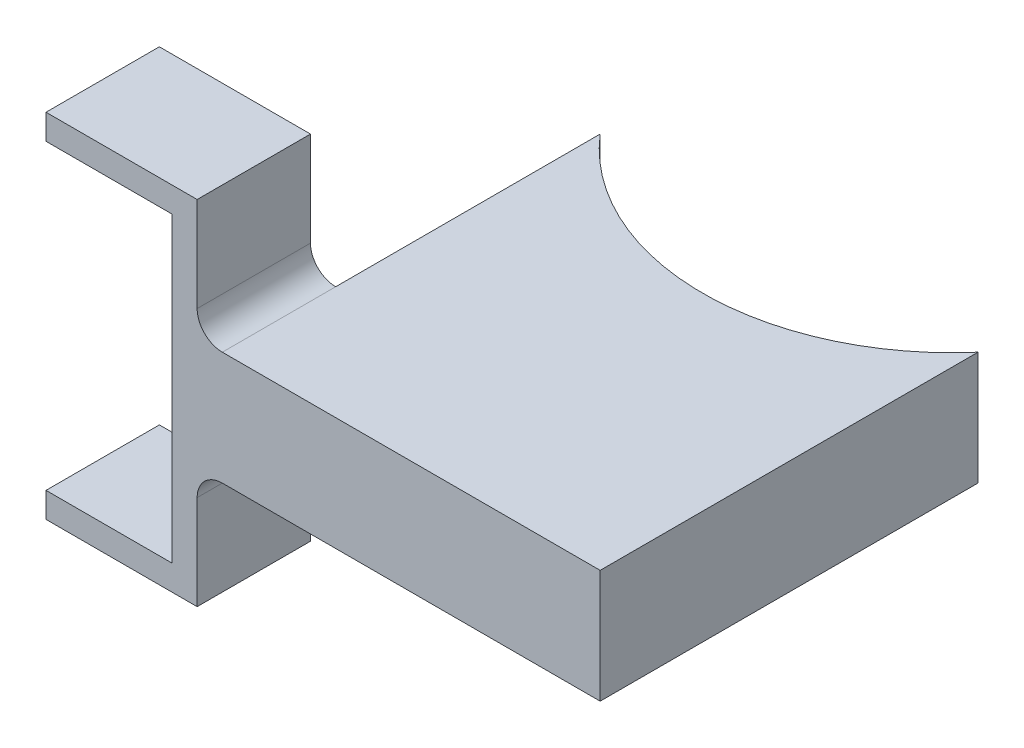
ISO-10303-21;
HEADER;
FILE_DESCRIPTION(('STEP AP214'),'2;1');
FILE_NAME('part.step','',(''),(''),'','','');
FILE_SCHEMA(('AUTOMOTIVE_DESIGN { 1 0 10303 214 1 1 1 1 }'));
ENDSEC;
DATA;
#1=APPLICATION_CONTEXT('core data for automotive mechanical design processes');
#2=APPLICATION_PROTOCOL_DEFINITION('international standard','automotive_design',2000,#1);
#3=PRODUCT_CONTEXT('',#1,'mechanical');
#4=PRODUCT('Part','Part','',(#3));
#5=PRODUCT_RELATED_PRODUCT_CATEGORY('part','',(#4));
#6=PRODUCT_DEFINITION_FORMATION('','',#4);
#7=PRODUCT_DEFINITION_CONTEXT('part definition',#1,'design');
#8=PRODUCT_DEFINITION('design','',#6,#7);
#9=PRODUCT_DEFINITION_SHAPE('','',#8);
#10=(LENGTH_UNIT() NAMED_UNIT(*) SI_UNIT(.MILLI.,.METRE.));
#11=(NAMED_UNIT(*) PLANE_ANGLE_UNIT() SI_UNIT($,.RADIAN.));
#12=(NAMED_UNIT(*) SI_UNIT($,.STERADIAN.) SOLID_ANGLE_UNIT());
#13=UNCERTAINTY_MEASURE_WITH_UNIT(LENGTH_MEASURE(1.E-05),#10,'distance_accuracy_value','');
#14=(GEOMETRIC_REPRESENTATION_CONTEXT(3) GLOBAL_UNCERTAINTY_ASSIGNED_CONTEXT((#13)) GLOBAL_UNIT_ASSIGNED_CONTEXT((#10,
#11,#12)) REPRESENTATION_CONTEXT('',''));
#15=CARTESIAN_POINT('',(0.,0.,0.));
#16=DIRECTION('',(0.,0.,1.));
#17=DIRECTION('',(1.,0.,0.));
#18=AXIS2_PLACEMENT_3D('',#15,#16,#17);
#19=CARTESIAN_POINT('',(-18.145943967969,-9.5,-8.54005946252346));
#20=DIRECTION('',(-1.,0.,0.));
#21=DIRECTION('',(0.,0.,1.));
#22=AXIS2_PLACEMENT_3D('',#19,#20,#21);
#23=PLANE('',#22);
#24=DIRECTION('',(0.,1.,0.));
#25=VECTOR('',#24,1.);
#26=CARTESIAN_POINT('',(-18.145943967969,-9.5,-8.54005946252346));
#27=LINE('',#26,#25);
#28=CARTESIAN_POINT('',(-18.145943967969,-7.5,-8.54005946252346));
#29=VERTEX_POINT('',#28);
#30=CARTESIAN_POINT('',(-18.145943967969,16.5,-8.54005946252346));
#31=VERTEX_POINT('',#30);
#32=EDGE_CURVE('E247',#29,#31,#27,.T.);
#33=ORIENTED_EDGE('',*,*,#32,.F.);
#34=DIRECTION('',(0.,0.,-1.));
#35=VECTOR('',#34,1.);
#36=CARTESIAN_POINT('',(-18.145943967969,-7.5,-8.54005946252346));
#37=LINE('',#36,#35);
#38=CARTESIAN_POINT('',(-18.145943967969,-7.5,0.459940537476534));
#39=VERTEX_POINT('',#38);
#40=EDGE_CURVE('E178',#39,#29,#37,.T.);
#41=ORIENTED_EDGE('',*,*,#40,.F.);
#42=DIRECTION('',(0.,1.,0.));
#43=VECTOR('',#42,1.);
#44=CARTESIAN_POINT('',(-18.145943967969,-9.5,0.459940537476534));
#45=LINE('',#44,#43);
#46=CARTESIAN_POINT('',(-18.145943967969,16.5,0.459940537476534));
#47=VERTEX_POINT('',#46);
#48=EDGE_CURVE('E244',#39,#47,#45,.T.);
#49=ORIENTED_EDGE('',*,*,#48,.T.);
#50=DIRECTION('',(0.,0.,1.));
#51=VECTOR('',#50,1.);
#52=CARTESIAN_POINT('',(-18.145943967969,16.5,-8.54005946252346));
#53=LINE('',#52,#51);
#54=EDGE_CURVE('E195',#31,#47,#53,.T.);
#55=ORIENTED_EDGE('',*,*,#54,.F.);
#56=EDGE_LOOP('',(#33,#41,#49,#55));
#57=FACE_BOUND('',#56,.T.);
#58=ADVANCED_FACE('F41',(#57),#23,.T.);
#59=CARTESIAN_POINT('',(-14.145943967969,9.,0.));
#60=DIRECTION('',(1.,0.,0.));
#61=DIRECTION('',(0.,0.,-1.));
#62=AXIS2_PLACEMENT_3D('',#59,#60,#61);
#63=PLANE('',#62);
#64=DIRECTION('',(0.,-1.,0.));
#65=VECTOR('',#64,1.);
#66=CARTESIAN_POINT('',(-14.145943967969,0.,-8.54005946252346));
#67=LINE('',#66,#65);
#68=CARTESIAN_POINT('',(-14.145943967969,9.,-8.54005946252346));
#69=VERTEX_POINT('',#68);
#70=CARTESIAN_POINT('',(-14.145943967969,0.,-8.54005946252346));
#71=VERTEX_POINT('',#70);
#72=EDGE_CURVE('E242',#69,#71,#67,.T.);
#73=ORIENTED_EDGE('',*,*,#72,.F.);
#74=DIRECTION('',(0.,0.,1.));
#75=VECTOR('',#74,1.);
#76=CARTESIAN_POINT('',(-14.145943967969,9.,0.));
#77=LINE('',#76,#75);
#78=CARTESIAN_POINT('',(-14.145943967969,9.,-29.5400594625235));
#79=VERTEX_POINT('',#78);
#80=EDGE_CURVE('E259',#79,#69,#77,.T.);
#81=ORIENTED_EDGE('',*,*,#80,.F.);
#82=DIRECTION('',(0.,-1.,0.));
#83=VECTOR('',#82,1.);
#84=CARTESIAN_POINT('',(-14.145943967969,9.,-29.5400594625235));
#85=LINE('',#84,#83);
#86=CARTESIAN_POINT('',(-14.145943967969,0.,-29.5400594625235));
#87=VERTEX_POINT('',#86);
#88=EDGE_CURVE('E290',#79,#87,#85,.T.);
#89=ORIENTED_EDGE('',*,*,#88,.T.);
#90=DIRECTION('',(0.,0.,1.));
#91=VECTOR('',#90,1.);
#92=CARTESIAN_POINT('',(-14.145943967969,0.,0.));
#93=LINE('',#92,#91);
#94=EDGE_CURVE('E274',#87,#71,#93,.T.);
#95=ORIENTED_EDGE('',*,*,#94,.T.);
#96=EDGE_LOOP('',(#73,#81,#89,#95));
#97=FACE_BOUND('',#96,.T.);
#98=ADVANCED_FACE('F317',(#97),#63,.F.);
#99=CARTESIAN_POINT('',(0.854056032030967,9.,-42.4644549996463));
#100=DIRECTION('',(0.,-1.,0.));
#101=DIRECTION('',(0.,0.,-1.));
#102=AXIS2_PLACEMENT_3D('',#99,#100,#101);
#103=CYLINDRICAL_SURFACE('',#102,19.8);
#104=CARTESIAN_POINT('',(0.854056032030967,0.,-42.4644549996463));
#105=DIRECTION('',(0.,1.,0.));
#106=DIRECTION('',(0.,0.,1.));
#107=AXIS2_PLACEMENT_3D('',#104,#105,#106);
#108=CIRCLE('',#107,19.8);
#109=CARTESIAN_POINT('',(15.854056032031,0.,-29.5400594625235));
#110=VERTEX_POINT('',#109);
#111=EDGE_CURVE('E254',#87,#110,#108,.T.);
#112=ORIENTED_EDGE('',*,*,#111,.F.);
#113=ORIENTED_EDGE('',*,*,#88,.F.);
#114=CARTESIAN_POINT('',(0.854056032030967,9.,-42.4644549996463));
#115=DIRECTION('',(0.,1.,0.));
#116=DIRECTION('',(0.,0.,1.));
#117=AXIS2_PLACEMENT_3D('',#114,#115,#116);
#118=CIRCLE('',#117,19.8);
#119=CARTESIAN_POINT('',(15.854056032031,9.,-29.5400594625235));
#120=VERTEX_POINT('',#119);
#121=EDGE_CURVE('E255',#79,#120,#118,.T.);
#122=ORIENTED_EDGE('',*,*,#121,.T.);
#123=DIRECTION('',(0.,-1.,0.));
#124=VECTOR('',#123,1.);
#125=CARTESIAN_POINT('',(15.854056032031,9.,-29.5400594625235));
#126=LINE('',#125,#124);
#127=EDGE_CURVE('E270',#120,#110,#126,.T.);
#128=ORIENTED_EDGE('',*,*,#127,.T.);
#129=EDGE_LOOP('',(#112,#113,#122,#128));
#130=FACE_BOUND('',#129,.T.);
#131=ADVANCED_FACE('F354',(#130),#103,.F.);
#132=CARTESIAN_POINT('',(0.,9.,0.459940537476534));
#133=DIRECTION('',(0.,0.,-1.));
#134=DIRECTION('',(-1.,0.,0.));
#135=AXIS2_PLACEMENT_3D('',#132,#133,#134);
#136=PLANE('',#135);
#137=DIRECTION('',(0.,1.,0.));
#138=VECTOR('',#137,1.);
#139=CARTESIAN_POINT('',(-16.145943967969,-9.5,0.459940537476534));
#140=LINE('',#139,#138);
#141=CARTESIAN_POINT('',(-16.145943967969,-9.5,0.459940537476534));
#142=VERTEX_POINT('',#141);
#143=CARTESIAN_POINT('',(-16.145943967969,-2.,0.459940537476534));
#144=VERTEX_POINT('',#143);
#145=EDGE_CURVE('E238',#142,#144,#140,.T.);
#146=ORIENTED_EDGE('',*,*,#145,.T.);
#147=CARTESIAN_POINT('',(-14.145943967969,-2.,0.459940537476534));
#148=DIRECTION('',(0.,0.,-1.));
#149=DIRECTION('',(-1.,0.,0.));
#150=AXIS2_PLACEMENT_3D('',#147,#148,#149);
#151=CIRCLE('',#150,2.);
#152=CARTESIAN_POINT('',(-14.145943967969,0.,0.459940537476534));
#153=VERTEX_POINT('',#152);
#154=EDGE_CURVE('E305',#144,#153,#151,.T.);
#155=ORIENTED_EDGE('',*,*,#154,.T.);
#156=DIRECTION('',(1.,0.,0.));
#157=VECTOR('',#156,1.);
#158=CARTESIAN_POINT('',(0.,0.,0.459940537476534));
#159=LINE('',#158,#157);
#160=CARTESIAN_POINT('',(15.854056032031,0.,0.459940537476534));
#161=VERTEX_POINT('',#160);
#162=EDGE_CURVE('E278',#153,#161,#159,.T.);
#163=ORIENTED_EDGE('',*,*,#162,.T.);
#164=DIRECTION('',(0.,-1.,0.));
#165=VECTOR('',#164,1.);
#166=CARTESIAN_POINT('',(15.854056032031,9.,0.459940537476534));
#167=LINE('',#166,#165);
#168=CARTESIAN_POINT('',(15.854056032031,9.,0.459940537476534));
#169=VERTEX_POINT('',#168);
#170=EDGE_CURVE('E286',#169,#161,#167,.T.);
#171=ORIENTED_EDGE('',*,*,#170,.F.);
#172=DIRECTION('',(1.,0.,0.));
#173=VECTOR('',#172,1.);
#174=CARTESIAN_POINT('',(0.,9.,0.459940537476534));
#175=LINE('',#174,#173);
#176=CARTESIAN_POINT('',(-14.145943967969,9.,0.459940537476534));
#177=VERTEX_POINT('',#176);
#178=EDGE_CURVE('E263',#177,#169,#175,.T.);
#179=ORIENTED_EDGE('',*,*,#178,.F.);
#180=CARTESIAN_POINT('',(-14.145943967969,11.,0.459940537476534));
#181=DIRECTION('',(0.,0.,-1.));
#182=DIRECTION('',(-1.,0.,0.));
#183=AXIS2_PLACEMENT_3D('',#180,#181,#182);
#184=CIRCLE('',#183,2.);
#185=CARTESIAN_POINT('',(-16.145943967969,11.,0.459940537476534));
#186=VERTEX_POINT('',#185);
#187=EDGE_CURVE('E11',#177,#186,#184,.T.);
#188=ORIENTED_EDGE('',*,*,#187,.T.);
#189=CARTESIAN_POINT('',(-16.145943967969,18.5,0.459940537476534));
#190=VERTEX_POINT('',#189);
#191=EDGE_CURVE('E243',#186,#190,#140,.T.);
#192=ORIENTED_EDGE('',*,*,#191,.T.);
#193=DIRECTION('',(1.,0.,0.));
#194=VECTOR('',#193,1.);
#195=CARTESIAN_POINT('',(-16.145943967969,18.5,0.459940537476534));
#196=LINE('',#195,#194);
#197=CARTESIAN_POINT('',(-28.145943967969,18.5,0.459940537476534));
#198=VERTEX_POINT('',#197);
#199=EDGE_CURVE('E229',#198,#190,#196,.T.);
#200=ORIENTED_EDGE('',*,*,#199,.F.);
#201=DIRECTION('',(0.,1.,0.));
#202=VECTOR('',#201,1.);
#203=CARTESIAN_POINT('',(-28.145943967969,18.5,0.459940537476534));
#204=LINE('',#203,#202);
#205=CARTESIAN_POINT('',(-28.145943967969,16.5,0.459940537476534));
#206=VERTEX_POINT('',#205);
#207=EDGE_CURVE('E203',#206,#198,#204,.T.);
#208=ORIENTED_EDGE('',*,*,#207,.F.);
#209=DIRECTION('',(1.,0.,0.));
#210=VECTOR('',#209,1.);
#211=CARTESIAN_POINT('',(-28.145943967969,16.5,0.459940537476534));
#212=LINE('',#211,#210);
#213=EDGE_CURVE('E211',#206,#47,#212,.T.);
#214=ORIENTED_EDGE('',*,*,#213,.T.);
#215=ORIENTED_EDGE('',*,*,#48,.F.);
#216=DIRECTION('',(1.,0.,0.));
#217=VECTOR('',#216,1.);
#218=CARTESIAN_POINT('',(-28.145943967969,-7.5,0.459940537476534));
#219=LINE('',#218,#217);
#220=CARTESIAN_POINT('',(-28.145943967969,-7.5,0.459940537476534));
#221=VERTEX_POINT('',#220);
#222=EDGE_CURVE('E191',#221,#39,#219,.T.);
#223=ORIENTED_EDGE('',*,*,#222,.F.);
#224=DIRECTION('',(0.,1.,0.));
#225=VECTOR('',#224,1.);
#226=CARTESIAN_POINT('',(-28.145943967969,-9.5,0.459940537476534));
#227=LINE('',#226,#225);
#228=CARTESIAN_POINT('',(-28.145943967969,-9.5,0.459940537476534));
#229=VERTEX_POINT('',#228);
#230=EDGE_CURVE('E171',#229,#221,#227,.T.);
#231=ORIENTED_EDGE('',*,*,#230,.F.);
#232=DIRECTION('',(1.,0.,0.));
#233=VECTOR('',#232,1.);
#234=CARTESIAN_POINT('',(-16.145943967969,-9.5,0.459940537476534));
#235=LINE('',#234,#233);
#236=EDGE_CURVE('E161',#229,#142,#235,.T.);
#237=ORIENTED_EDGE('',*,*,#236,.T.);
#238=EDGE_LOOP('',(#146,#155,#163,#171,#179,#188,#192,#200,#208,#214,#215,#223,#231,#237));
#239=FACE_BOUND('',#238,.T.);
#240=ADVANCED_FACE('F325',(#239),#136,.F.);
#241=CARTESIAN_POINT('',(15.854056032031,9.,0.));
#242=DIRECTION('',(1.,0.,0.));
#243=DIRECTION('',(0.,0.,-1.));
#244=AXIS2_PLACEMENT_3D('',#241,#242,#243);
#245=PLANE('',#244);
#246=DIRECTION('',(0.,0.,1.));
#247=VECTOR('',#246,1.);
#248=CARTESIAN_POINT('',(15.854056032031,0.,0.));
#249=LINE('',#248,#247);
#250=EDGE_CURVE('E260',#110,#161,#249,.T.);
#251=ORIENTED_EDGE('',*,*,#250,.F.);
#252=ORIENTED_EDGE('',*,*,#127,.F.);
#253=DIRECTION('',(0.,0.,1.));
#254=VECTOR('',#253,1.);
#255=CARTESIAN_POINT('',(15.854056032031,9.,0.));
#256=LINE('',#255,#254);
#257=EDGE_CURVE('E266',#120,#169,#256,.T.);
#258=ORIENTED_EDGE('',*,*,#257,.T.);
#259=ORIENTED_EDGE('',*,*,#170,.T.);
#260=EDGE_LOOP('',(#251,#252,#258,#259));
#261=FACE_BOUND('',#260,.T.);
#262=ADVANCED_FACE('F368',(#261),#245,.T.);
#263=CARTESIAN_POINT('',(0.,9.,0.));
#264=DIRECTION('',(0.,1.,0.));
#265=DIRECTION('',(0.,0.,1.));
#266=AXIS2_PLACEMENT_3D('',#263,#264,#265);
#267=PLANE('',#266);
#268=ORIENTED_EDGE('',*,*,#80,.T.);
#269=DIRECTION('',(0.,0.,-1.));
#270=VECTOR('',#269,1.);
#271=CARTESIAN_POINT('',(-14.145943967969,9.,0.459940537476534));
#272=LINE('',#271,#270);
#273=EDGE_CURVE('E57',#69,#177,#272,.F.);
#274=ORIENTED_EDGE('',*,*,#273,.T.);
#275=ORIENTED_EDGE('',*,*,#178,.T.);
#276=ORIENTED_EDGE('',*,*,#257,.F.);
#277=ORIENTED_EDGE('',*,*,#121,.F.);
#278=EDGE_LOOP('',(#268,#274,#275,#276,#277));
#279=FACE_BOUND('',#278,.T.);
#280=ADVANCED_FACE('F320',(#279),#267,.T.);
#281=CARTESIAN_POINT('',(0.,0.,0.));
#282=DIRECTION('',(0.,1.,0.));
#283=DIRECTION('',(0.,0.,1.));
#284=AXIS2_PLACEMENT_3D('',#281,#282,#283);
#285=PLANE('',#284);
#286=ORIENTED_EDGE('',*,*,#162,.F.);
#287=DIRECTION('',(0.,0.,1.));
#288=VECTOR('',#287,1.);
#289=CARTESIAN_POINT('',(-14.145943967969,0.,0.));
#290=LINE('',#289,#288);
#291=EDGE_CURVE('E297',#153,#71,#290,.F.);
#292=ORIENTED_EDGE('',*,*,#291,.T.);
#293=ORIENTED_EDGE('',*,*,#94,.F.);
#294=ORIENTED_EDGE('',*,*,#111,.T.);
#295=ORIENTED_EDGE('',*,*,#250,.T.);
#296=EDGE_LOOP('',(#286,#292,#293,#294,#295));
#297=FACE_BOUND('',#296,.T.);
#298=ADVANCED_FACE('F365',(#297),#285,.F.);
#299=CARTESIAN_POINT('',(-16.145943967969,0.,-8.54005946252346));
#300=DIRECTION('',(0.,0.,1.));
#301=DIRECTION('',(1.,0.,0.));
#302=AXIS2_PLACEMENT_3D('',#299,#300,#301);
#303=PLANE('',#302);
#304=ORIENTED_EDGE('',*,*,#72,.T.);
#305=CARTESIAN_POINT('',(-14.145943967969,-2.,-8.54005946252346));
#306=DIRECTION('',(0.,0.,1.));
#307=DIRECTION('',(1.,0.,0.));
#308=AXIS2_PLACEMENT_3D('',#305,#306,#307);
#309=CIRCLE('',#308,2.);
#310=CARTESIAN_POINT('',(-16.145943967969,-2.,-8.54005946252346));
#311=VERTEX_POINT('',#310);
#312=EDGE_CURVE('E308',#71,#311,#309,.T.);
#313=ORIENTED_EDGE('',*,*,#312,.T.);
#314=DIRECTION('',(0.,1.,0.));
#315=VECTOR('',#314,1.);
#316=CARTESIAN_POINT('',(-16.145943967969,-9.5,-8.54005946252346));
#317=LINE('',#316,#315);
#318=CARTESIAN_POINT('',(-16.145943967969,-9.5,-8.54005946252346));
#319=VERTEX_POINT('',#318);
#320=EDGE_CURVE('E156',#319,#311,#317,.T.);
#321=ORIENTED_EDGE('',*,*,#320,.F.);
#322=DIRECTION('',(-1.,0.,0.));
#323=VECTOR('',#322,1.);
#324=CARTESIAN_POINT('',(-16.145943967969,-9.5,-8.54005946252346));
#325=LINE('',#324,#323);
#326=CARTESIAN_POINT('',(-28.145943967969,-9.5,-8.54005946252346));
#327=VERTEX_POINT('',#326);
#328=EDGE_CURVE('E148',#319,#327,#325,.T.);
#329=ORIENTED_EDGE('',*,*,#328,.T.);
#330=DIRECTION('',(0.,-1.,0.));
#331=VECTOR('',#330,1.);
#332=CARTESIAN_POINT('',(-28.145943967969,-9.5,-8.54005946252346));
#333=LINE('',#332,#331);
#334=CARTESIAN_POINT('',(-28.145943967969,-7.5,-8.54005946252346));
#335=VERTEX_POINT('',#334);
#336=EDGE_CURVE('E154',#335,#327,#333,.T.);
#337=ORIENTED_EDGE('',*,*,#336,.F.);
#338=DIRECTION('',(1.,0.,0.));
#339=VECTOR('',#338,1.);
#340=CARTESIAN_POINT('',(-28.145943967969,-7.5,-8.54005946252346));
#341=LINE('',#340,#339);
#342=EDGE_CURVE('E187',#335,#29,#341,.T.);
#343=ORIENTED_EDGE('',*,*,#342,.T.);
#344=ORIENTED_EDGE('',*,*,#32,.T.);
#345=DIRECTION('',(1.,0.,0.));
#346=VECTOR('',#345,1.);
#347=CARTESIAN_POINT('',(-28.145943967969,16.5,-8.54005946252346));
#348=LINE('',#347,#346);
#349=CARTESIAN_POINT('',(-28.145943967969,16.5,-8.54005946252346));
#350=VERTEX_POINT('',#349);
#351=EDGE_CURVE('E218',#350,#31,#348,.T.);
#352=ORIENTED_EDGE('',*,*,#351,.F.);
#353=DIRECTION('',(0.,-1.,0.));
#354=VECTOR('',#353,1.);
#355=CARTESIAN_POINT('',(-28.145943967969,18.5,-8.54005946252346));
#356=LINE('',#355,#354);
#357=CARTESIAN_POINT('',(-28.145943967969,18.5,-8.54005946252346));
#358=VERTEX_POINT('',#357);
#359=EDGE_CURVE('E196',#358,#350,#356,.T.);
#360=ORIENTED_EDGE('',*,*,#359,.F.);
#361=DIRECTION('',(-1.,0.,0.));
#362=VECTOR('',#361,1.);
#363=CARTESIAN_POINT('',(-16.145943967969,18.5,-8.54005946252346));
#364=LINE('',#363,#362);
#365=CARTESIAN_POINT('',(-16.145943967969,18.5,-8.54005946252346));
#366=VERTEX_POINT('',#365);
#367=EDGE_CURVE('E226',#366,#358,#364,.T.);
#368=ORIENTED_EDGE('',*,*,#367,.F.);
#369=CARTESIAN_POINT('',(-16.145943967969,11.,-8.54005946252346));
#370=VERTEX_POINT('',#369);
#371=EDGE_CURVE('E237',#370,#366,#317,.T.);
#372=ORIENTED_EDGE('',*,*,#371,.F.);
#373=CARTESIAN_POINT('',(-14.145943967969,11.,-8.54005946252346));
#374=DIRECTION('',(0.,0.,1.));
#375=DIRECTION('',(1.,0.,0.));
#376=AXIS2_PLACEMENT_3D('',#373,#374,#375);
#377=CIRCLE('',#376,2.);
#378=EDGE_CURVE('E50',#370,#69,#377,.T.);
#379=ORIENTED_EDGE('',*,*,#378,.T.);
#380=EDGE_LOOP('',(#304,#313,#321,#329,#337,#343,#344,#352,#360,#368,#372,#379));
#381=FACE_BOUND('',#380,.T.);
#382=ADVANCED_FACE('F151',(#381),#303,.F.);
#383=CARTESIAN_POINT('',(-16.145943967969,-9.5,-8.54005946252346));
#384=DIRECTION('',(1.,0.,0.));
#385=DIRECTION('',(0.,0.,-1.));
#386=AXIS2_PLACEMENT_3D('',#383,#384,#385);
#387=PLANE('',#386);
#388=ORIENTED_EDGE('',*,*,#191,.F.);
#389=DIRECTION('',(0.,0.,-1.));
#390=VECTOR('',#389,1.);
#391=CARTESIAN_POINT('',(-16.145943967969,11.,-8.54005946252346));
#392=LINE('',#391,#390);
#393=EDGE_CURVE('E300',#186,#370,#392,.T.);
#394=ORIENTED_EDGE('',*,*,#393,.T.);
#395=ORIENTED_EDGE('',*,*,#371,.T.);
#396=DIRECTION('',(0.,0.,-1.));
#397=VECTOR('',#396,1.);
#398=CARTESIAN_POINT('',(-16.145943967969,18.5,-8.54005946252346));
#399=LINE('',#398,#397);
#400=EDGE_CURVE('E222',#190,#366,#399,.T.);
#401=ORIENTED_EDGE('',*,*,#400,.F.);
#402=EDGE_LOOP('',(#388,#394,#395,#401));
#403=FACE_BOUND('',#402,.T.);
#404=ADVANCED_FACE('F329',(#403),#387,.T.);
#405=ORIENTED_EDGE('',*,*,#320,.T.);
#406=DIRECTION('',(0.,0.,1.));
#407=VECTOR('',#406,1.);
#408=CARTESIAN_POINT('',(-16.145943967969,-2.,-8.54005946252346));
#409=LINE('',#408,#407);
#410=EDGE_CURVE('E293',#311,#144,#409,.T.);
#411=ORIENTED_EDGE('',*,*,#410,.T.);
#412=ORIENTED_EDGE('',*,*,#145,.F.);
#413=DIRECTION('',(0.,0.,-1.));
#414=VECTOR('',#413,1.);
#415=CARTESIAN_POINT('',(-16.145943967969,-9.5,-8.54005946252346));
#416=LINE('',#415,#414);
#417=EDGE_CURVE('E162',#142,#319,#416,.T.);
#418=ORIENTED_EDGE('',*,*,#417,.T.);
#419=EDGE_LOOP('',(#405,#411,#412,#418));
#420=FACE_BOUND('',#419,.T.);
#421=ADVANCED_FACE('F359',(#420),#387,.T.);
#422=CARTESIAN_POINT('',(0.,-9.5,0.));
#423=DIRECTION('',(0.,-1.,0.));
#424=DIRECTION('',(0.,0.,-1.));
#425=AXIS2_PLACEMENT_3D('',#422,#423,#424);
#426=PLANE('',#425);
#427=ORIENTED_EDGE('',*,*,#417,.F.);
#428=ORIENTED_EDGE('',*,*,#236,.F.);
#429=DIRECTION('',(0.,0.,1.));
#430=VECTOR('',#429,1.);
#431=CARTESIAN_POINT('',(-28.145943967969,-9.5,-8.54005946252346));
#432=LINE('',#431,#430);
#433=EDGE_CURVE('E165',#327,#229,#432,.T.);
#434=ORIENTED_EDGE('',*,*,#433,.F.);
#435=ORIENTED_EDGE('',*,*,#328,.F.);
#436=EDGE_LOOP('',(#427,#428,#434,#435));
#437=FACE_BOUND('',#436,.T.);
#438=ADVANCED_FACE('F166',(#437),#426,.T.);
#439=CARTESIAN_POINT('',(0.,18.5,0.));
#440=DIRECTION('',(0.,-1.,0.));
#441=DIRECTION('',(0.,0.,-1.));
#442=AXIS2_PLACEMENT_3D('',#439,#440,#441);
#443=PLANE('',#442);
#444=ORIENTED_EDGE('',*,*,#400,.T.);
#445=ORIENTED_EDGE('',*,*,#367,.T.);
#446=DIRECTION('',(0.,0.,-1.));
#447=VECTOR('',#446,1.);
#448=CARTESIAN_POINT('',(-28.145943967969,18.5,-8.54005946252346));
#449=LINE('',#448,#447);
#450=EDGE_CURVE('E207',#198,#358,#449,.T.);
#451=ORIENTED_EDGE('',*,*,#450,.F.);
#452=ORIENTED_EDGE('',*,*,#199,.T.);
#453=EDGE_LOOP('',(#444,#445,#451,#452));
#454=FACE_BOUND('',#453,.T.);
#455=ADVANCED_FACE('F336',(#454),#443,.F.);
#456=CARTESIAN_POINT('',(-28.145943967969,16.5,-8.54005946252346));
#457=DIRECTION('',(0.,1.,0.));
#458=DIRECTION('',(0.,0.,1.));
#459=AXIS2_PLACEMENT_3D('',#456,#457,#458);
#460=PLANE('',#459);
#461=ORIENTED_EDGE('',*,*,#54,.T.);
#462=ORIENTED_EDGE('',*,*,#213,.F.);
#463=DIRECTION('',(0.,0.,1.));
#464=VECTOR('',#463,1.);
#465=CARTESIAN_POINT('',(-28.145943967969,16.5,-8.54005946252346));
#466=LINE('',#465,#464);
#467=EDGE_CURVE('E200',#350,#206,#466,.T.);
#468=ORIENTED_EDGE('',*,*,#467,.F.);
#469=ORIENTED_EDGE('',*,*,#351,.T.);
#470=EDGE_LOOP('',(#461,#462,#468,#469));
#471=FACE_BOUND('',#470,.T.);
#472=ADVANCED_FACE('F342',(#471),#460,.F.);
#473=CARTESIAN_POINT('',(-28.145943967969,0.,0.));
#474=DIRECTION('',(-1.,0.,0.));
#475=DIRECTION('',(0.,0.,1.));
#476=AXIS2_PLACEMENT_3D('',#473,#474,#475);
#477=PLANE('',#476);
#478=ORIENTED_EDGE('',*,*,#359,.T.);
#479=ORIENTED_EDGE('',*,*,#467,.T.);
#480=ORIENTED_EDGE('',*,*,#207,.T.);
#481=ORIENTED_EDGE('',*,*,#450,.T.);
#482=EDGE_LOOP('',(#478,#479,#480,#481));
#483=FACE_BOUND('',#482,.T.);
#484=ADVANCED_FACE('F339',(#483),#477,.T.);
#485=CARTESIAN_POINT('',(-28.145943967969,-7.5,-8.54005946252346));
#486=DIRECTION('',(0.,-1.,0.));
#487=DIRECTION('',(0.,0.,-1.));
#488=AXIS2_PLACEMENT_3D('',#485,#486,#487);
#489=PLANE('',#488);
#490=ORIENTED_EDGE('',*,*,#40,.T.);
#491=ORIENTED_EDGE('',*,*,#342,.F.);
#492=DIRECTION('',(0.,0.,-1.));
#493=VECTOR('',#492,1.);
#494=CARTESIAN_POINT('',(-28.145943967969,-7.5,-8.54005946252346));
#495=LINE('',#494,#493);
#496=EDGE_CURVE('E175',#221,#335,#495,.T.);
#497=ORIENTED_EDGE('',*,*,#496,.F.);
#498=ORIENTED_EDGE('',*,*,#222,.T.);
#499=EDGE_LOOP('',(#490,#491,#497,#498));
#500=FACE_BOUND('',#499,.T.);
#501=ADVANCED_FACE('F348',(#500),#489,.F.);
#502=CARTESIAN_POINT('',(-28.145943967969,0.,0.));
#503=DIRECTION('',(1.,0.,0.));
#504=DIRECTION('',(0.,0.,-1.));
#505=AXIS2_PLACEMENT_3D('',#502,#503,#504);
#506=PLANE('',#505);
#507=ORIENTED_EDGE('',*,*,#336,.T.);
#508=ORIENTED_EDGE('',*,*,#433,.T.);
#509=ORIENTED_EDGE('',*,*,#230,.T.);
#510=ORIENTED_EDGE('',*,*,#496,.T.);
#511=EDGE_LOOP('',(#507,#508,#509,#510));
#512=FACE_BOUND('',#511,.T.);
#513=ADVANCED_FACE('F173',(#512),#506,.F.);
#514=CARTESIAN_POINT('',(-14.145943967969,-2.,-8.54005946252346));
#515=DIRECTION('',(0.,0.,1.));
#516=DIRECTION('',(1.,0.,0.));
#517=AXIS2_PLACEMENT_3D('',#514,#515,#516);
#518=CYLINDRICAL_SURFACE('',#517,2.);
#519=ORIENTED_EDGE('',*,*,#312,.F.);
#520=ORIENTED_EDGE('',*,*,#291,.F.);
#521=ORIENTED_EDGE('',*,*,#154,.F.);
#522=ORIENTED_EDGE('',*,*,#410,.F.);
#523=EDGE_LOOP('',(#519,#520,#521,#522));
#524=FACE_BOUND('',#523,.T.);
#525=ADVANCED_FACE('F379',(#524),#518,.F.);
#526=CARTESIAN_POINT('',(-14.145943967969,11.,-8.54005946252346));
#527=DIRECTION('',(0.,0.,1.));
#528=DIRECTION('',(1.,0.,0.));
#529=AXIS2_PLACEMENT_3D('',#526,#527,#528);
#530=CYLINDRICAL_SURFACE('',#529,2.);
#531=ORIENTED_EDGE('',*,*,#187,.F.);
#532=ORIENTED_EDGE('',*,*,#273,.F.);
#533=ORIENTED_EDGE('',*,*,#378,.F.);
#534=ORIENTED_EDGE('',*,*,#393,.F.);
#535=EDGE_LOOP('',(#531,#532,#533,#534));
#536=FACE_BOUND('',#535,.T.);
#537=ADVANCED_FACE('F43',(#536),#530,.F.);
#538=CLOSED_SHELL('',(#58,#98,#131,#240,#262,#280,#298,#382,#404,#421,#438,#455,#472,#484,#501,
#513,#525,#537));
#539=MANIFOLD_SOLID_BREP('B2',#538);
#540=ADVANCED_BREP_SHAPE_REPRESENTATION('',(#18,#539),#14);
#541=SHAPE_DEFINITION_REPRESENTATION(#9,#540);
ENDSEC;
END-ISO-10303-21;
